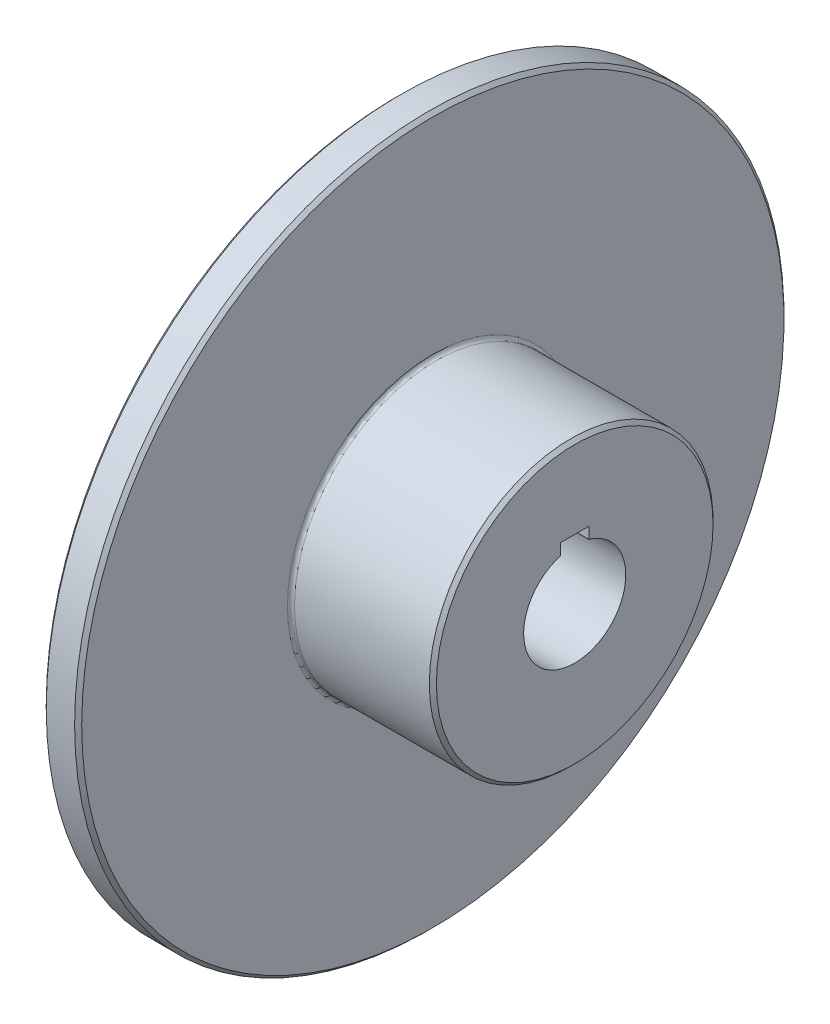
ISO-10303-21;
HEADER;
FILE_DESCRIPTION(('STEP AP214'),'2;1');
FILE_NAME('part.step','',(''),(''),'','','');
FILE_SCHEMA(('AUTOMOTIVE_DESIGN { 1 0 10303 214 1 1 1 1 }'));
ENDSEC;
DATA;
#1=APPLICATION_CONTEXT('core data for automotive mechanical design processes');
#2=APPLICATION_PROTOCOL_DEFINITION('international standard','automotive_design',2000,#1);
#3=PRODUCT_CONTEXT('',#1,'mechanical');
#4=PRODUCT('Part','Part','',(#3));
#5=PRODUCT_RELATED_PRODUCT_CATEGORY('part','',(#4));
#6=PRODUCT_DEFINITION_FORMATION('','',#4);
#7=PRODUCT_DEFINITION_CONTEXT('part definition',#1,'design');
#8=PRODUCT_DEFINITION('design','',#6,#7);
#9=PRODUCT_DEFINITION_SHAPE('','',#8);
#10=(LENGTH_UNIT() NAMED_UNIT(*) SI_UNIT(.MILLI.,.METRE.));
#11=(NAMED_UNIT(*) PLANE_ANGLE_UNIT() SI_UNIT($,.RADIAN.));
#12=(NAMED_UNIT(*) SI_UNIT($,.STERADIAN.) SOLID_ANGLE_UNIT());
#13=UNCERTAINTY_MEASURE_WITH_UNIT(LENGTH_MEASURE(1.E-05),#10,'distance_accuracy_value','');
#14=(GEOMETRIC_REPRESENTATION_CONTEXT(3) GLOBAL_UNCERTAINTY_ASSIGNED_CONTEXT((#13)) GLOBAL_UNIT_ASSIGNED_CONTEXT((#10,
#11,#12)) REPRESENTATION_CONTEXT('',''));
#15=CARTESIAN_POINT('',(0.,0.,0.));
#16=DIRECTION('',(0.,0.,1.));
#17=DIRECTION('',(1.,0.,0.));
#18=AXIS2_PLACEMENT_3D('',#15,#16,#17);
#19=CARTESIAN_POINT('',(0.,123.75,0.));
#20=DIRECTION('',(1.,0.,0.));
#21=DIRECTION('',(0.,0.,-1.));
#22=AXIS2_PLACEMENT_3D('',#19,#20,#21);
#23=PLANE('',#22);
#24=DIRECTION('',(0.,0.,1.));
#25=VECTOR('',#24,1.);
#26=CARTESIAN_POINT('',(0.,21.3,0.));
#27=LINE('',#26,#25);
#28=CARTESIAN_POINT('',(0.,21.3,-5.));
#29=VERTEX_POINT('',#28);
#30=CARTESIAN_POINT('',(0.,21.3,5.));
#31=VERTEX_POINT('',#30);
#32=EDGE_CURVE('E71',#29,#31,#27,.T.);
#33=ORIENTED_EDGE('',*,*,#32,.T.);
#34=DIRECTION('',(0.,-1.,0.));
#35=VECTOR('',#34,1.);
#36=CARTESIAN_POINT('',(0.,123.75,5.));
#37=LINE('',#36,#35);
#38=CARTESIAN_POINT('',(0.,17.2916164657906,5.));
#39=VERTEX_POINT('',#38);
#40=EDGE_CURVE('E118',#31,#39,#37,.T.);
#41=ORIENTED_EDGE('',*,*,#40,.T.);
#42=CARTESIAN_POINT('',(0.,0.,0.));
#43=DIRECTION('',(-1.,0.,0.));
#44=DIRECTION('',(0.,0.,1.));
#45=AXIS2_PLACEMENT_3D('',#42,#43,#44);
#46=CIRCLE('',#45,18.);
#47=CARTESIAN_POINT('',(0.,17.2916164657906,-5.));
#48=VERTEX_POINT('',#47);
#49=EDGE_CURVE('E64',#48,#39,#46,.T.);
#50=ORIENTED_EDGE('',*,*,#49,.F.);
#51=DIRECTION('',(0.,1.,0.));
#52=VECTOR('',#51,1.);
#53=CARTESIAN_POINT('',(0.,123.75,-5.));
#54=LINE('',#53,#52);
#55=EDGE_CURVE('E125',#48,#29,#54,.T.);
#56=ORIENTED_EDGE('',*,*,#55,.T.);
#57=EDGE_LOOP('',(#33,#41,#50,#56));
#58=FACE_BOUND('',#57,.T.);
#59=CARTESIAN_POINT('',(0.,0.,0.));
#60=DIRECTION('',(-1.,0.,0.));
#61=DIRECTION('',(0.,0.,1.));
#62=AXIS2_PLACEMENT_3D('',#59,#60,#61);
#63=CIRCLE('',#62,123.75);
#64=CARTESIAN_POINT('',(0.,0.,123.75));
#65=VERTEX_POINT('',#64);
#66=EDGE_CURVE('E114',#65,#65,#63,.T.);
#67=ORIENTED_EDGE('',*,*,#66,.T.);
#68=EDGE_LOOP('',(#67));
#69=FACE_BOUND('',#68,.T.);
#70=ADVANCED_FACE('F15',(#58,#69),#23,.F.);
#71=CARTESIAN_POINT('',(0.,0.,0.));
#72=DIRECTION('',(-1.,0.,0.));
#73=DIRECTION('',(0.,0.,1.));
#74=AXIS2_PLACEMENT_3D('',#71,#72,#73);
#75=CYLINDRICAL_SURFACE('',#74,18.);
#76=ORIENTED_EDGE('',*,*,#49,.T.);
#77=DIRECTION('',(-1.,0.,0.));
#78=VECTOR('',#77,1.);
#79=CARTESIAN_POINT('',(0.,17.2916164657906,5.));
#80=LINE('',#79,#78);
#81=CARTESIAN_POINT('',(62.5,17.2916164657906,5.));
#82=VERTEX_POINT('',#81);
#83=EDGE_CURVE('E38',#39,#82,#80,.F.);
#84=ORIENTED_EDGE('',*,*,#83,.T.);
#85=CARTESIAN_POINT('',(62.5,0.,0.));
#86=DIRECTION('',(-1.,0.,0.));
#87=DIRECTION('',(0.,0.,1.));
#88=AXIS2_PLACEMENT_3D('',#85,#86,#87);
#89=CIRCLE('',#88,18.);
#90=CARTESIAN_POINT('',(62.5,17.2916164657906,-5.));
#91=VERTEX_POINT('',#90);
#92=EDGE_CURVE('E83',#91,#82,#89,.T.);
#93=ORIENTED_EDGE('',*,*,#92,.F.);
#94=DIRECTION('',(-1.,0.,0.));
#95=VECTOR('',#94,1.);
#96=CARTESIAN_POINT('',(0.,17.2916164657906,-5.));
#97=LINE('',#96,#95);
#98=EDGE_CURVE('E30',#91,#48,#97,.T.);
#99=ORIENTED_EDGE('',*,*,#98,.T.);
#100=EDGE_LOOP('',(#76,#84,#93,#99));
#101=FACE_BOUND('',#100,.T.);
#102=ADVANCED_FACE('F139',(#101),#75,.F.);
#103=CARTESIAN_POINT('',(62.5,18.,0.));
#104=DIRECTION('',(-1.,0.,0.));
#105=DIRECTION('',(0.,0.,1.));
#106=AXIS2_PLACEMENT_3D('',#103,#104,#105);
#107=PLANE('',#106);
#108=CARTESIAN_POINT('',(62.5,0.,0.));
#109=DIRECTION('',(-1.,0.,0.));
#110=DIRECTION('',(0.,0.,1.));
#111=AXIS2_PLACEMENT_3D('',#108,#109,#110);
#112=CIRCLE('',#111,48.75);
#113=CARTESIAN_POINT('',(62.5,0.,48.75));
#114=VERTEX_POINT('',#113);
#115=EDGE_CURVE('E86',#114,#114,#112,.T.);
#116=ORIENTED_EDGE('',*,*,#115,.F.);
#117=EDGE_LOOP('',(#116));
#118=FACE_BOUND('',#117,.T.);
#119=ORIENTED_EDGE('',*,*,#92,.T.);
#120=DIRECTION('',(0.,1.,0.));
#121=VECTOR('',#120,1.);
#122=CARTESIAN_POINT('',(62.5,18.,5.));
#123=LINE('',#122,#121);
#124=CARTESIAN_POINT('',(62.5,21.3,5.));
#125=VERTEX_POINT('',#124);
#126=EDGE_CURVE('E9',#82,#125,#123,.T.);
#127=ORIENTED_EDGE('',*,*,#126,.T.);
#128=DIRECTION('',(0.,0.,-1.));
#129=VECTOR('',#128,1.);
#130=CARTESIAN_POINT('',(62.5,21.3,0.));
#131=LINE('',#130,#129);
#132=CARTESIAN_POINT('',(62.5,21.3,-5.));
#133=VERTEX_POINT('',#132);
#134=EDGE_CURVE('E23',#125,#133,#131,.T.);
#135=ORIENTED_EDGE('',*,*,#134,.T.);
#136=DIRECTION('',(0.,-1.,0.));
#137=VECTOR('',#136,1.);
#138=CARTESIAN_POINT('',(62.5,18.,-5.));
#139=LINE('',#138,#137);
#140=EDGE_CURVE('E54',#133,#91,#139,.T.);
#141=ORIENTED_EDGE('',*,*,#140,.T.);
#142=EDGE_LOOP('',(#119,#127,#135,#141));
#143=FACE_BOUND('',#142,.T.);
#144=ADVANCED_FACE('F75',(#118,#143),#107,.F.);
#145=CARTESIAN_POINT('',(62.5,0.,0.));
#146=DIRECTION('',(-1.,0.,0.));
#147=DIRECTION('',(0.,0.,1.));
#148=AXIS2_PLACEMENT_3D('',#145,#146,#147);
#149=CONICAL_SURFACE('',#148,48.75,0.785398163397448);
#150=CARTESIAN_POINT('',(61.25,0.,0.));
#151=DIRECTION('',(-1.,0.,0.));
#152=DIRECTION('',(0.,0.,1.));
#153=AXIS2_PLACEMENT_3D('',#150,#151,#152);
#154=CIRCLE('',#153,50.);
#155=CARTESIAN_POINT('',(61.25,0.,50.));
#156=VERTEX_POINT('',#155);
#157=EDGE_CURVE('E90',#156,#156,#154,.T.);
#158=ORIENTED_EDGE('',*,*,#157,.F.);
#159=EDGE_LOOP('',(#158));
#160=FACE_BOUND('',#159,.T.);
#161=ORIENTED_EDGE('',*,*,#115,.T.);
#162=EDGE_LOOP('',(#161));
#163=FACE_BOUND('',#162,.T.);
#164=ADVANCED_FACE('F146',(#160,#163),#149,.T.);
#165=CARTESIAN_POINT('',(0.,0.,0.));
#166=DIRECTION('',(-1.,0.,0.));
#167=DIRECTION('',(0.,0.,1.));
#168=AXIS2_PLACEMENT_3D('',#165,#166,#167);
#169=CYLINDRICAL_SURFACE('',#168,50.);
#170=CARTESIAN_POINT('',(13.75,0.,0.));
#171=DIRECTION('',(-1.,0.,0.));
#172=DIRECTION('',(0.,0.,1.));
#173=AXIS2_PLACEMENT_3D('',#170,#171,#172);
#174=CIRCLE('',#173,50.);
#175=CARTESIAN_POINT('',(13.75,0.,50.));
#176=VERTEX_POINT('',#175);
#177=EDGE_CURVE('E94',#176,#176,#174,.T.);
#178=ORIENTED_EDGE('',*,*,#177,.F.);
#179=EDGE_LOOP('',(#178));
#180=FACE_BOUND('',#179,.T.);
#181=ORIENTED_EDGE('',*,*,#157,.T.);
#182=EDGE_LOOP('',(#181));
#183=FACE_BOUND('',#182,.T.);
#184=ADVANCED_FACE('F152',(#180,#183),#169,.T.);
#185=CARTESIAN_POINT('',(13.75,0.,0.));
#186=DIRECTION('',(-1.,0.,0.));
#187=DIRECTION('',(0.,0.,1.));
#188=AXIS2_PLACEMENT_3D('',#185,#186,#187);
#189=TOROIDAL_SURFACE('',#188,51.25,1.25);
#190=ORIENTED_EDGE('',*,*,#177,.T.);
#191=EDGE_LOOP('',(#190));
#192=FACE_BOUND('',#191,.T.);
#193=CARTESIAN_POINT('',(12.5,0.,0.));
#194=DIRECTION('',(-1.,0.,0.));
#195=DIRECTION('',(0.,0.,1.));
#196=AXIS2_PLACEMENT_3D('',#193,#194,#195);
#197=CIRCLE('',#196,51.25);
#198=CARTESIAN_POINT('',(12.5,0.,51.25));
#199=VERTEX_POINT('',#198);
#200=EDGE_CURVE('E98',#199,#199,#197,.T.);
#201=ORIENTED_EDGE('',*,*,#200,.F.);
#202=EDGE_LOOP('',(#201));
#203=FACE_BOUND('',#202,.T.);
#204=ADVANCED_FACE('F156',(#192,#203),#189,.F.);
#205=CARTESIAN_POINT('',(12.5,51.25,0.));
#206=DIRECTION('',(-1.,0.,0.));
#207=DIRECTION('',(0.,0.,1.));
#208=AXIS2_PLACEMENT_3D('',#205,#206,#207);
#209=PLANE('',#208);
#210=CARTESIAN_POINT('',(12.5,0.,0.));
#211=DIRECTION('',(-1.,0.,0.));
#212=DIRECTION('',(0.,0.,1.));
#213=AXIS2_PLACEMENT_3D('',#210,#211,#212);
#214=CIRCLE('',#213,123.75);
#215=CARTESIAN_POINT('',(12.5,0.,123.75));
#216=VERTEX_POINT('',#215);
#217=EDGE_CURVE('E102',#216,#216,#214,.T.);
#218=ORIENTED_EDGE('',*,*,#217,.F.);
#219=EDGE_LOOP('',(#218));
#220=FACE_BOUND('',#219,.T.);
#221=ORIENTED_EDGE('',*,*,#200,.T.);
#222=EDGE_LOOP('',(#221));
#223=FACE_BOUND('',#222,.T.);
#224=ADVANCED_FACE('F160',(#220,#223),#209,.F.);
#225=CARTESIAN_POINT('',(12.5,0.,0.));
#226=DIRECTION('',(-1.,0.,0.));
#227=DIRECTION('',(0.,0.,1.));
#228=AXIS2_PLACEMENT_3D('',#225,#226,#227);
#229=CONICAL_SURFACE('',#228,123.75,0.785398163397448);
#230=CARTESIAN_POINT('',(11.25,0.,0.));
#231=DIRECTION('',(-1.,0.,0.));
#232=DIRECTION('',(0.,0.,1.));
#233=AXIS2_PLACEMENT_3D('',#230,#231,#232);
#234=CIRCLE('',#233,125.);
#235=CARTESIAN_POINT('',(11.25,0.,125.));
#236=VERTEX_POINT('',#235);
#237=EDGE_CURVE('E106',#236,#236,#234,.T.);
#238=ORIENTED_EDGE('',*,*,#237,.F.);
#239=EDGE_LOOP('',(#238));
#240=FACE_BOUND('',#239,.T.);
#241=ORIENTED_EDGE('',*,*,#217,.T.);
#242=EDGE_LOOP('',(#241));
#243=FACE_BOUND('',#242,.T.);
#244=ADVANCED_FACE('F164',(#240,#243),#229,.T.);
#245=CARTESIAN_POINT('',(0.,0.,0.));
#246=DIRECTION('',(-1.,0.,0.));
#247=DIRECTION('',(0.,0.,1.));
#248=AXIS2_PLACEMENT_3D('',#245,#246,#247);
#249=CYLINDRICAL_SURFACE('',#248,125.);
#250=CARTESIAN_POINT('',(1.25,0.,0.));
#251=DIRECTION('',(-1.,0.,0.));
#252=DIRECTION('',(0.,0.,1.));
#253=AXIS2_PLACEMENT_3D('',#250,#251,#252);
#254=CIRCLE('',#253,125.);
#255=CARTESIAN_POINT('',(1.25,0.,125.));
#256=VERTEX_POINT('',#255);
#257=EDGE_CURVE('E110',#256,#256,#254,.T.);
#258=ORIENTED_EDGE('',*,*,#257,.F.);
#259=EDGE_LOOP('',(#258));
#260=FACE_BOUND('',#259,.T.);
#261=ORIENTED_EDGE('',*,*,#237,.T.);
#262=EDGE_LOOP('',(#261));
#263=FACE_BOUND('',#262,.T.);
#264=ADVANCED_FACE('F168',(#260,#263),#249,.T.);
#265=CARTESIAN_POINT('',(1.25,0.,0.));
#266=DIRECTION('',(1.,0.,0.));
#267=DIRECTION('',(0.,0.,-1.));
#268=AXIS2_PLACEMENT_3D('',#265,#266,#267);
#269=CONICAL_SURFACE('',#268,125.,0.785398163397448);
#270=ORIENTED_EDGE('',*,*,#66,.F.);
#271=EDGE_LOOP('',(#270));
#272=FACE_BOUND('',#271,.T.);
#273=ORIENTED_EDGE('',*,*,#257,.T.);
#274=EDGE_LOOP('',(#273));
#275=FACE_BOUND('',#274,.T.);
#276=ADVANCED_FACE('F172',(#272,#275),#269,.T.);
#277=CARTESIAN_POINT('',(31.25,10.65,5.));
#278=DIRECTION('',(0.,0.,1.));
#279=DIRECTION('',(1.,0.,0.));
#280=AXIS2_PLACEMENT_3D('',#277,#278,#279);
#281=PLANE('',#280);
#282=DIRECTION('',(1.,0.,0.));
#283=VECTOR('',#282,1.);
#284=CARTESIAN_POINT('',(31.25,21.3,5.));
#285=LINE('',#284,#283);
#286=EDGE_CURVE('E73',#31,#125,#285,.T.);
#287=ORIENTED_EDGE('',*,*,#286,.T.);
#288=ORIENTED_EDGE('',*,*,#126,.F.);
#289=ORIENTED_EDGE('',*,*,#83,.F.);
#290=ORIENTED_EDGE('',*,*,#40,.F.);
#291=EDGE_LOOP('',(#287,#288,#289,#290));
#292=FACE_BOUND('',#291,.T.);
#293=ADVANCED_FACE('F134',(#292),#281,.F.);
#294=CARTESIAN_POINT('',(31.25,21.3,-5.));
#295=DIRECTION('',(0.,1.,0.));
#296=DIRECTION('',(0.,0.,1.));
#297=AXIS2_PLACEMENT_3D('',#294,#295,#296);
#298=PLANE('',#297);
#299=DIRECTION('',(-1.,0.,0.));
#300=VECTOR('',#299,1.);
#301=CARTESIAN_POINT('',(31.25,21.3,-5.));
#302=LINE('',#301,#300);
#303=EDGE_CURVE('E57',#133,#29,#302,.T.);
#304=ORIENTED_EDGE('',*,*,#303,.F.);
#305=ORIENTED_EDGE('',*,*,#134,.F.);
#306=ORIENTED_EDGE('',*,*,#286,.F.);
#307=ORIENTED_EDGE('',*,*,#32,.F.);
#308=EDGE_LOOP('',(#304,#305,#306,#307));
#309=FACE_BOUND('',#308,.T.);
#310=ADVANCED_FACE('F67',(#309),#298,.F.);
#311=CARTESIAN_POINT('',(31.25,10.65,-5.));
#312=DIRECTION('',(0.,0.,-1.));
#313=DIRECTION('',(-1.,0.,0.));
#314=AXIS2_PLACEMENT_3D('',#311,#312,#313);
#315=PLANE('',#314);
#316=ORIENTED_EDGE('',*,*,#98,.F.);
#317=ORIENTED_EDGE('',*,*,#140,.F.);
#318=ORIENTED_EDGE('',*,*,#303,.T.);
#319=ORIENTED_EDGE('',*,*,#55,.F.);
#320=EDGE_LOOP('',(#316,#317,#318,#319));
#321=FACE_BOUND('',#320,.T.);
#322=ADVANCED_FACE('F56',(#321),#315,.F.);
#323=CLOSED_SHELL('',(#70,#102,#144,#164,#184,#204,#224,#244,#264,#276,#293,#310,#322));
#324=MANIFOLD_SOLID_BREP('B1',#323);
#325=ADVANCED_BREP_SHAPE_REPRESENTATION('',(#18,#324),#14);
#326=SHAPE_DEFINITION_REPRESENTATION(#9,#325);
ENDSEC;
END-ISO-10303-21;
